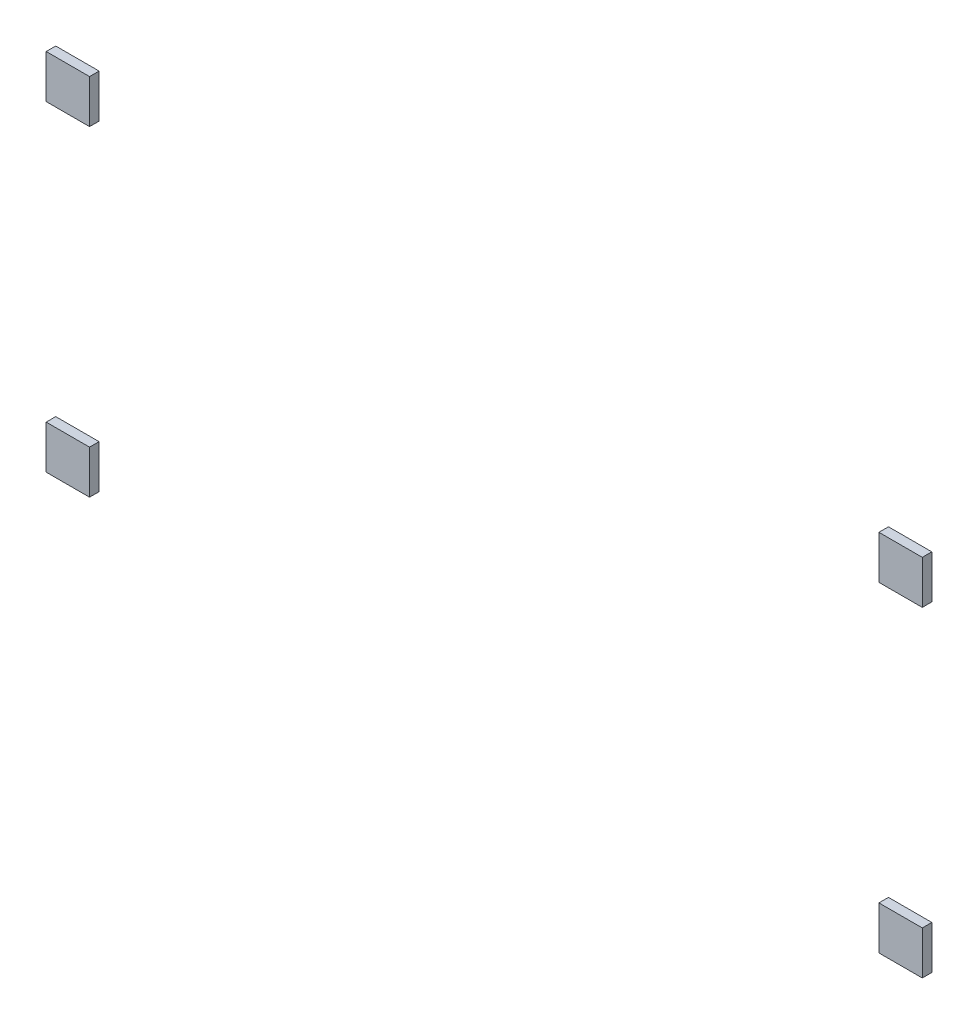
ISO-10303-21;
HEADER;
FILE_DESCRIPTION(('STEP AP214'),'2;1');
FILE_NAME('part.step','',(''),(''),'','','');
FILE_SCHEMA(('AUTOMOTIVE_DESIGN { 1 0 10303 214 1 1 1 1 }'));
ENDSEC;
DATA;
#1=APPLICATION_CONTEXT('core data for automotive mechanical design processes');
#2=APPLICATION_PROTOCOL_DEFINITION('international standard','automotive_design',2000,#1);
#3=PRODUCT_CONTEXT('',#1,'mechanical');
#4=PRODUCT('Part','Part','',(#3));
#5=PRODUCT_RELATED_PRODUCT_CATEGORY('part','',(#4));
#6=PRODUCT_DEFINITION_FORMATION('','',#4);
#7=PRODUCT_DEFINITION_CONTEXT('part definition',#1,'design');
#8=PRODUCT_DEFINITION('design','',#6,#7);
#9=PRODUCT_DEFINITION_SHAPE('','',#8);
#10=(LENGTH_UNIT() NAMED_UNIT(*) SI_UNIT(.MILLI.,.METRE.));
#11=(NAMED_UNIT(*) PLANE_ANGLE_UNIT() SI_UNIT($,.RADIAN.));
#12=(NAMED_UNIT(*) SI_UNIT($,.STERADIAN.) SOLID_ANGLE_UNIT());
#13=UNCERTAINTY_MEASURE_WITH_UNIT(LENGTH_MEASURE(1.E-05),#10,'distance_accuracy_value','');
#14=(GEOMETRIC_REPRESENTATION_CONTEXT(3) GLOBAL_UNCERTAINTY_ASSIGNED_CONTEXT((#13)) GLOBAL_UNIT_ASSIGNED_CONTEXT((#10,
#11,#12)) REPRESENTATION_CONTEXT('',''));
#15=CARTESIAN_POINT('',(0.,0.,0.));
#16=DIRECTION('',(0.,0.,1.));
#17=DIRECTION('',(1.,0.,0.));
#18=AXIS2_PLACEMENT_3D('',#15,#16,#17);
#19=CARTESIAN_POINT('',(-505.,160.,6.));
#20=DIRECTION('',(0.,0.,1.));
#21=DIRECTION('',(1.,0.,0.));
#22=AXIS2_PLACEMENT_3D('',#19,#20,#21);
#23=PLANE('',#22);
#24=DIRECTION('',(0.,1.,0.));
#25=VECTOR('',#24,1.);
#26=CARTESIAN_POINT('',(-505.,160.,6.));
#27=LINE('',#26,#25);
#28=CARTESIAN_POINT('',(-505.,160.,6.));
#29=VERTEX_POINT('',#28);
#30=CARTESIAN_POINT('',(-505.,210.,6.));
#31=VERTEX_POINT('',#30);
#32=EDGE_CURVE('P0_E56',#29,#31,#27,.T.);
#33=ORIENTED_EDGE('',*,*,#32,.F.);
#34=DIRECTION('',(1.,0.,0.));
#35=VECTOR('',#34,1.);
#36=CARTESIAN_POINT('',(-505.,160.,6.));
#37=LINE('',#36,#35);
#38=CARTESIAN_POINT('',(-455.,160.,6.));
#39=VERTEX_POINT('',#38);
#40=EDGE_CURVE('P0_E52',#29,#39,#37,.T.);
#41=ORIENTED_EDGE('',*,*,#40,.T.);
#42=DIRECTION('',(0.,1.,0.));
#43=VECTOR('',#42,1.);
#44=CARTESIAN_POINT('',(-455.,160.,6.));
#45=LINE('',#44,#43);
#46=CARTESIAN_POINT('',(-455.,210.,6.));
#47=VERTEX_POINT('',#46);
#48=EDGE_CURVE('P0_E54',#39,#47,#45,.T.);
#49=ORIENTED_EDGE('',*,*,#48,.T.);
#50=DIRECTION('',(1.,0.,0.));
#51=VECTOR('',#50,1.);
#52=CARTESIAN_POINT('',(-505.,210.,6.));
#53=LINE('',#52,#51);
#54=EDGE_CURVE('P0_E11',#31,#47,#53,.T.);
#55=ORIENTED_EDGE('',*,*,#54,.F.);
#56=EDGE_LOOP('',(#33,#41,#49,#55));
#57=FACE_BOUND('',#56,.T.);
#58=ADVANCED_FACE('P0_F17',(#57),#23,.T.);
#59=CARTESIAN_POINT('',(-505.,160.,-5.));
#60=DIRECTION('',(0.,0.,1.));
#61=DIRECTION('',(1.,0.,0.));
#62=AXIS2_PLACEMENT_3D('',#59,#60,#61);
#63=PLANE('',#62);
#64=DIRECTION('',(1.,0.,0.));
#65=VECTOR('',#64,1.);
#66=CARTESIAN_POINT('',(-505.,210.,-5.));
#67=LINE('',#66,#65);
#68=CARTESIAN_POINT('',(-505.,210.,-5.));
#69=VERTEX_POINT('',#68);
#70=CARTESIAN_POINT('',(-455.,210.,-5.));
#71=VERTEX_POINT('',#70);
#72=EDGE_CURVE('P0_E27',#69,#71,#67,.T.);
#73=ORIENTED_EDGE('',*,*,#72,.T.);
#74=DIRECTION('',(0.,1.,0.));
#75=VECTOR('',#74,1.);
#76=CARTESIAN_POINT('',(-455.,160.,-5.));
#77=LINE('',#76,#75);
#78=CARTESIAN_POINT('',(-455.,160.,-5.));
#79=VERTEX_POINT('',#78);
#80=EDGE_CURVE('P0_E77',#79,#71,#77,.T.);
#81=ORIENTED_EDGE('',*,*,#80,.F.);
#82=DIRECTION('',(1.,0.,0.));
#83=VECTOR('',#82,1.);
#84=CARTESIAN_POINT('',(-505.,160.,-5.));
#85=LINE('',#84,#83);
#86=CARTESIAN_POINT('',(-505.,160.,-5.));
#87=VERTEX_POINT('',#86);
#88=EDGE_CURVE('P0_E65',#87,#79,#85,.T.);
#89=ORIENTED_EDGE('',*,*,#88,.F.);
#90=DIRECTION('',(0.,1.,0.));
#91=VECTOR('',#90,1.);
#92=CARTESIAN_POINT('',(-505.,160.,-5.));
#93=LINE('',#92,#91);
#94=EDGE_CURVE('P0_E88',#87,#69,#93,.T.);
#95=ORIENTED_EDGE('',*,*,#94,.T.);
#96=EDGE_LOOP('',(#73,#81,#89,#95));
#97=FACE_BOUND('',#96,.T.);
#98=ADVANCED_FACE('P0_F129',(#97),#63,.F.);
#99=CARTESIAN_POINT('',(-505.,210.,-5.));
#100=DIRECTION('',(0.,1.,0.));
#101=DIRECTION('',(1.,0.,0.));
#102=AXIS2_PLACEMENT_3D('',#99,#100,#101);
#103=PLANE('',#102);
#104=ORIENTED_EDGE('',*,*,#72,.F.);
#105=DIRECTION('',(0.,0.,1.));
#106=VECTOR('',#105,1.);
#107=CARTESIAN_POINT('',(-505.,210.,-5.));
#108=LINE('',#107,#106);
#109=EDGE_CURVE('P0_E162',#69,#31,#108,.T.);
#110=ORIENTED_EDGE('',*,*,#109,.T.);
#111=ORIENTED_EDGE('',*,*,#54,.T.);
#112=DIRECTION('',(0.,0.,1.));
#113=VECTOR('',#112,1.);
#114=CARTESIAN_POINT('',(-455.,210.,-5.));
#115=LINE('',#114,#113);
#116=EDGE_CURVE('P0_E71',#71,#47,#115,.T.);
#117=ORIENTED_EDGE('',*,*,#116,.F.);
#118=EDGE_LOOP('',(#104,#110,#111,#117));
#119=FACE_BOUND('',#118,.T.);
#120=ADVANCED_FACE('P0_F125',(#119),#103,.T.);
#121=CARTESIAN_POINT('',(-505.,160.,-5.));
#122=DIRECTION('',(0.,1.,0.));
#123=DIRECTION('',(1.,0.,0.));
#124=AXIS2_PLACEMENT_3D('',#121,#122,#123);
#125=PLANE('',#124);
#126=DIRECTION('',(0.,0.,1.));
#127=VECTOR('',#126,1.);
#128=CARTESIAN_POINT('',(-455.,160.,-5.));
#129=LINE('',#128,#127);
#130=EDGE_CURVE('P0_E75',#79,#39,#129,.T.);
#131=ORIENTED_EDGE('',*,*,#130,.T.);
#132=ORIENTED_EDGE('',*,*,#40,.F.);
#133=DIRECTION('',(0.,0.,1.));
#134=VECTOR('',#133,1.);
#135=CARTESIAN_POINT('',(-505.,160.,-5.));
#136=LINE('',#135,#134);
#137=EDGE_CURVE('P0_E78',#87,#29,#136,.T.);
#138=ORIENTED_EDGE('',*,*,#137,.F.);
#139=ORIENTED_EDGE('',*,*,#88,.T.);
#140=EDGE_LOOP('',(#131,#132,#138,#139));
#141=FACE_BOUND('',#140,.T.);
#142=ADVANCED_FACE('P0_F72',(#141),#125,.F.);
#143=CARTESIAN_POINT('',(-455.,160.,-5.));
#144=DIRECTION('',(1.,0.,0.));
#145=DIRECTION('',(0.,1.,0.));
#146=AXIS2_PLACEMENT_3D('',#143,#144,#145);
#147=PLANE('',#146);
#148=ORIENTED_EDGE('',*,*,#130,.F.);
#149=ORIENTED_EDGE('',*,*,#80,.T.);
#150=ORIENTED_EDGE('',*,*,#116,.T.);
#151=ORIENTED_EDGE('',*,*,#48,.F.);
#152=EDGE_LOOP('',(#148,#149,#150,#151));
#153=FACE_BOUND('',#152,.T.);
#154=ADVANCED_FACE('P0_F67',(#153),#147,.T.);
#155=CARTESIAN_POINT('',(-505.,160.,-5.));
#156=DIRECTION('',(1.,0.,0.));
#157=DIRECTION('',(0.,1.,0.));
#158=AXIS2_PLACEMENT_3D('',#155,#156,#157);
#159=PLANE('',#158);
#160=ORIENTED_EDGE('',*,*,#32,.T.);
#161=ORIENTED_EDGE('',*,*,#109,.F.);
#162=ORIENTED_EDGE('',*,*,#94,.F.);
#163=ORIENTED_EDGE('',*,*,#137,.T.);
#164=EDGE_LOOP('',(#160,#161,#162,#163));
#165=FACE_BOUND('',#164,.T.);
#166=ADVANCED_FACE('P0_F101',(#165),#159,.F.);
#167=CLOSED_SHELL('',(#58,#98,#120,#142,#154,#166));
#168=MANIFOLD_SOLID_BREP('P0_B1',#167);
#169=CARTESIAN_POINT('',(455.,-210.,6.));
#170=DIRECTION('',(0.,0.,1.));
#171=DIRECTION('',(1.,0.,0.));
#172=AXIS2_PLACEMENT_3D('',#169,#170,#171);
#173=PLANE('',#172);
#174=DIRECTION('',(0.,1.,0.));
#175=VECTOR('',#174,1.);
#176=CARTESIAN_POINT('',(455.,-210.,6.));
#177=LINE('',#176,#175);
#178=CARTESIAN_POINT('',(455.,-210.,6.));
#179=VERTEX_POINT('',#178);
#180=CARTESIAN_POINT('',(455.,-160.,6.));
#181=VERTEX_POINT('',#180);
#182=EDGE_CURVE('P1_E86',#179,#181,#177,.T.);
#183=ORIENTED_EDGE('',*,*,#182,.F.);
#184=DIRECTION('',(1.,0.,0.));
#185=VECTOR('',#184,1.);
#186=CARTESIAN_POINT('',(455.,-210.,6.));
#187=LINE('',#186,#185);
#188=CARTESIAN_POINT('',(505.,-210.,6.));
#189=VERTEX_POINT('',#188);
#190=EDGE_CURVE('P1_E69',#179,#189,#187,.T.);
#191=ORIENTED_EDGE('',*,*,#190,.T.);
#192=DIRECTION('',(0.,1.,0.));
#193=VECTOR('',#192,1.);
#194=CARTESIAN_POINT('',(505.,-210.,6.));
#195=LINE('',#194,#193);
#196=CARTESIAN_POINT('',(505.,-160.,6.));
#197=VERTEX_POINT('',#196);
#198=EDGE_CURVE('P1_E85',#189,#197,#195,.T.);
#199=ORIENTED_EDGE('',*,*,#198,.T.);
#200=DIRECTION('',(1.,0.,0.));
#201=VECTOR('',#200,1.);
#202=CARTESIAN_POINT('',(455.,-160.,6.));
#203=LINE('',#202,#201);
#204=EDGE_CURVE('P1_E11',#181,#197,#203,.T.);
#205=ORIENTED_EDGE('',*,*,#204,.F.);
#206=EDGE_LOOP('',(#183,#191,#199,#205));
#207=FACE_BOUND('',#206,.T.);
#208=ADVANCED_FACE('P1_F17',(#207),#173,.T.);
#209=CARTESIAN_POINT('',(455.,-210.,-5.));
#210=DIRECTION('',(0.,0.,1.));
#211=DIRECTION('',(1.,0.,0.));
#212=AXIS2_PLACEMENT_3D('',#209,#210,#211);
#213=PLANE('',#212);
#214=DIRECTION('',(1.,0.,0.));
#215=VECTOR('',#214,1.);
#216=CARTESIAN_POINT('',(455.,-160.,-5.));
#217=LINE('',#216,#215);
#218=CARTESIAN_POINT('',(455.,-160.,-5.));
#219=VERTEX_POINT('',#218);
#220=CARTESIAN_POINT('',(505.,-160.,-5.));
#221=VERTEX_POINT('',#220);
#222=EDGE_CURVE('P1_E25',#219,#221,#217,.T.);
#223=ORIENTED_EDGE('',*,*,#222,.T.);
#224=DIRECTION('',(0.,1.,0.));
#225=VECTOR('',#224,1.);
#226=CARTESIAN_POINT('',(505.,-210.,-5.));
#227=LINE('',#226,#225);
#228=CARTESIAN_POINT('',(505.,-210.,-5.));
#229=VERTEX_POINT('',#228);
#230=EDGE_CURVE('P1_E108',#229,#221,#227,.T.);
#231=ORIENTED_EDGE('',*,*,#230,.F.);
#232=DIRECTION('',(1.,0.,0.));
#233=VECTOR('',#232,1.);
#234=CARTESIAN_POINT('',(455.,-210.,-5.));
#235=LINE('',#234,#233);
#236=CARTESIAN_POINT('',(455.,-210.,-5.));
#237=VERTEX_POINT('',#236);
#238=EDGE_CURVE('P1_E81',#237,#229,#235,.T.);
#239=ORIENTED_EDGE('',*,*,#238,.F.);
#240=DIRECTION('',(0.,1.,0.));
#241=VECTOR('',#240,1.);
#242=CARTESIAN_POINT('',(455.,-210.,-5.));
#243=LINE('',#242,#241);
#244=EDGE_CURVE('P1_E90',#237,#219,#243,.T.);
#245=ORIENTED_EDGE('',*,*,#244,.T.);
#246=EDGE_LOOP('',(#223,#231,#239,#245));
#247=FACE_BOUND('',#246,.T.);
#248=ADVANCED_FACE('P1_F148',(#247),#213,.F.);
#249=CARTESIAN_POINT('',(455.,-160.,-5.));
#250=DIRECTION('',(0.,1.,0.));
#251=DIRECTION('',(1.,0.,0.));
#252=AXIS2_PLACEMENT_3D('',#249,#250,#251);
#253=PLANE('',#252);
#254=ORIENTED_EDGE('',*,*,#222,.F.);
#255=DIRECTION('',(0.,0.,1.));
#256=VECTOR('',#255,1.);
#257=CARTESIAN_POINT('',(455.,-160.,-5.));
#258=LINE('',#257,#256);
#259=EDGE_CURVE('P1_E91',#219,#181,#258,.T.);
#260=ORIENTED_EDGE('',*,*,#259,.T.);
#261=ORIENTED_EDGE('',*,*,#204,.T.);
#262=DIRECTION('',(0.,0.,1.));
#263=VECTOR('',#262,1.);
#264=CARTESIAN_POINT('',(505.,-160.,-5.));
#265=LINE('',#264,#263);
#266=EDGE_CURVE('P1_E104',#221,#197,#265,.T.);
#267=ORIENTED_EDGE('',*,*,#266,.F.);
#268=EDGE_LOOP('',(#254,#260,#261,#267));
#269=FACE_BOUND('',#268,.T.);
#270=ADVANCED_FACE('P1_F138',(#269),#253,.T.);
#271=CARTESIAN_POINT('',(455.,-210.,-5.));
#272=DIRECTION('',(0.,1.,0.));
#273=DIRECTION('',(1.,0.,0.));
#274=AXIS2_PLACEMENT_3D('',#271,#272,#273);
#275=PLANE('',#274);
#276=DIRECTION('',(0.,0.,1.));
#277=VECTOR('',#276,1.);
#278=CARTESIAN_POINT('',(505.,-210.,-5.));
#279=LINE('',#278,#277);
#280=EDGE_CURVE('P1_E76',#229,#189,#279,.T.);
#281=ORIENTED_EDGE('',*,*,#280,.T.);
#282=ORIENTED_EDGE('',*,*,#190,.F.);
#283=DIRECTION('',(0.,0.,1.));
#284=VECTOR('',#283,1.);
#285=CARTESIAN_POINT('',(455.,-210.,-5.));
#286=LINE('',#285,#284);
#287=EDGE_CURVE('P1_E73',#237,#179,#286,.T.);
#288=ORIENTED_EDGE('',*,*,#287,.F.);
#289=ORIENTED_EDGE('',*,*,#238,.T.);
#290=EDGE_LOOP('',(#281,#282,#288,#289));
#291=FACE_BOUND('',#290,.T.);
#292=ADVANCED_FACE('P1_F71',(#291),#275,.F.);
#293=CARTESIAN_POINT('',(505.,-210.,-5.));
#294=DIRECTION('',(1.,0.,0.));
#295=DIRECTION('',(0.,1.,0.));
#296=AXIS2_PLACEMENT_3D('',#293,#294,#295);
#297=PLANE('',#296);
#298=ORIENTED_EDGE('',*,*,#280,.F.);
#299=ORIENTED_EDGE('',*,*,#230,.T.);
#300=ORIENTED_EDGE('',*,*,#266,.T.);
#301=ORIENTED_EDGE('',*,*,#198,.F.);
#302=EDGE_LOOP('',(#298,#299,#300,#301));
#303=FACE_BOUND('',#302,.T.);
#304=ADVANCED_FACE('P1_F121',(#303),#297,.T.);
#305=CARTESIAN_POINT('',(455.,-210.,-5.));
#306=DIRECTION('',(1.,0.,0.));
#307=DIRECTION('',(0.,1.,0.));
#308=AXIS2_PLACEMENT_3D('',#305,#306,#307);
#309=PLANE('',#308);
#310=ORIENTED_EDGE('',*,*,#182,.T.);
#311=ORIENTED_EDGE('',*,*,#259,.F.);
#312=ORIENTED_EDGE('',*,*,#244,.F.);
#313=ORIENTED_EDGE('',*,*,#287,.T.);
#314=EDGE_LOOP('',(#310,#311,#312,#313));
#315=FACE_BOUND('',#314,.T.);
#316=ADVANCED_FACE('P1_F88',(#315),#309,.F.);
#317=CLOSED_SHELL('',(#208,#248,#270,#292,#304,#316));
#318=MANIFOLD_SOLID_BREP('P1_B1',#317);
#319=CARTESIAN_POINT('',(-505.,-210.,6.));
#320=DIRECTION('',(0.,0.,1.));
#321=DIRECTION('',(1.,0.,0.));
#322=AXIS2_PLACEMENT_3D('',#319,#320,#321);
#323=PLANE('',#322);
#324=DIRECTION('',(0.,1.,0.));
#325=VECTOR('',#324,1.);
#326=CARTESIAN_POINT('',(-505.,-210.,6.));
#327=LINE('',#326,#325);
#328=CARTESIAN_POINT('',(-505.,-210.,6.));
#329=VERTEX_POINT('',#328);
#330=CARTESIAN_POINT('',(-505.,-160.,6.));
#331=VERTEX_POINT('',#330);
#332=EDGE_CURVE('P2_E89',#329,#331,#327,.T.);
#333=ORIENTED_EDGE('',*,*,#332,.F.);
#334=DIRECTION('',(1.,0.,0.));
#335=VECTOR('',#334,1.);
#336=CARTESIAN_POINT('',(-505.,-210.,6.));
#337=LINE('',#336,#335);
#338=CARTESIAN_POINT('',(-455.,-210.,6.));
#339=VERTEX_POINT('',#338);
#340=EDGE_CURVE('P2_E71',#329,#339,#337,.T.);
#341=ORIENTED_EDGE('',*,*,#340,.T.);
#342=DIRECTION('',(0.,1.,0.));
#343=VECTOR('',#342,1.);
#344=CARTESIAN_POINT('',(-455.,-210.,6.));
#345=LINE('',#344,#343);
#346=CARTESIAN_POINT('',(-455.,-160.,6.));
#347=VERTEX_POINT('',#346);
#348=EDGE_CURVE('P2_E82',#339,#347,#345,.T.);
#349=ORIENTED_EDGE('',*,*,#348,.T.);
#350=DIRECTION('',(1.,0.,0.));
#351=VECTOR('',#350,1.);
#352=CARTESIAN_POINT('',(-505.,-160.,6.));
#353=LINE('',#352,#351);
#354=EDGE_CURVE('P2_E11',#331,#347,#353,.T.);
#355=ORIENTED_EDGE('',*,*,#354,.F.);
#356=EDGE_LOOP('',(#333,#341,#349,#355));
#357=FACE_BOUND('',#356,.T.);
#358=ADVANCED_FACE('P2_F17',(#357),#323,.T.);
#359=CARTESIAN_POINT('',(-505.,-210.,-5.));
#360=DIRECTION('',(0.,0.,1.));
#361=DIRECTION('',(1.,0.,0.));
#362=AXIS2_PLACEMENT_3D('',#359,#360,#361);
#363=PLANE('',#362);
#364=DIRECTION('',(1.,0.,0.));
#365=VECTOR('',#364,1.);
#366=CARTESIAN_POINT('',(-505.,-160.,-5.));
#367=LINE('',#366,#365);
#368=CARTESIAN_POINT('',(-505.,-160.,-5.));
#369=VERTEX_POINT('',#368);
#370=CARTESIAN_POINT('',(-455.,-160.,-5.));
#371=VERTEX_POINT('',#370);
#372=EDGE_CURVE('P2_E21',#369,#371,#367,.T.);
#373=ORIENTED_EDGE('',*,*,#372,.T.);
#374=DIRECTION('',(0.,1.,0.));
#375=VECTOR('',#374,1.);
#376=CARTESIAN_POINT('',(-455.,-210.,-5.));
#377=LINE('',#376,#375);
#378=CARTESIAN_POINT('',(-455.,-210.,-5.));
#379=VERTEX_POINT('',#378);
#380=EDGE_CURVE('P2_E104',#379,#371,#377,.T.);
#381=ORIENTED_EDGE('',*,*,#380,.F.);
#382=DIRECTION('',(1.,0.,0.));
#383=VECTOR('',#382,1.);
#384=CARTESIAN_POINT('',(-505.,-210.,-5.));
#385=LINE('',#384,#383);
#386=CARTESIAN_POINT('',(-505.,-210.,-5.));
#387=VERTEX_POINT('',#386);
#388=EDGE_CURVE('P2_E83',#387,#379,#385,.T.);
#389=ORIENTED_EDGE('',*,*,#388,.F.);
#390=DIRECTION('',(0.,1.,0.));
#391=VECTOR('',#390,1.);
#392=CARTESIAN_POINT('',(-505.,-210.,-5.));
#393=LINE('',#392,#391);
#394=EDGE_CURVE('P2_E93',#387,#369,#393,.T.);
#395=ORIENTED_EDGE('',*,*,#394,.T.);
#396=EDGE_LOOP('',(#373,#381,#389,#395));
#397=FACE_BOUND('',#396,.T.);
#398=ADVANCED_FACE('P2_F19',(#397),#363,.F.);
#399=CARTESIAN_POINT('',(-505.,-160.,-5.));
#400=DIRECTION('',(0.,1.,0.));
#401=DIRECTION('',(1.,0.,0.));
#402=AXIS2_PLACEMENT_3D('',#399,#400,#401);
#403=PLANE('',#402);
#404=ORIENTED_EDGE('',*,*,#372,.F.);
#405=DIRECTION('',(0.,0.,1.));
#406=VECTOR('',#405,1.);
#407=CARTESIAN_POINT('',(-505.,-160.,-5.));
#408=LINE('',#407,#406);
#409=EDGE_CURVE('P2_E92',#369,#331,#408,.T.);
#410=ORIENTED_EDGE('',*,*,#409,.T.);
#411=ORIENTED_EDGE('',*,*,#354,.T.);
#412=DIRECTION('',(0.,0.,1.));
#413=VECTOR('',#412,1.);
#414=CARTESIAN_POINT('',(-455.,-160.,-5.));
#415=LINE('',#414,#413);
#416=EDGE_CURVE('P2_E106',#371,#347,#415,.T.);
#417=ORIENTED_EDGE('',*,*,#416,.F.);
#418=EDGE_LOOP('',(#404,#410,#411,#417));
#419=FACE_BOUND('',#418,.T.);
#420=ADVANCED_FACE('P2_F142',(#419),#403,.T.);
#421=CARTESIAN_POINT('',(-505.,-210.,-5.));
#422=DIRECTION('',(0.,1.,0.));
#423=DIRECTION('',(1.,0.,0.));
#424=AXIS2_PLACEMENT_3D('',#421,#422,#423);
#425=PLANE('',#424);
#426=DIRECTION('',(0.,0.,1.));
#427=VECTOR('',#426,1.);
#428=CARTESIAN_POINT('',(-455.,-210.,-5.));
#429=LINE('',#428,#427);
#430=EDGE_CURVE('P2_E77',#379,#339,#429,.T.);
#431=ORIENTED_EDGE('',*,*,#430,.T.);
#432=ORIENTED_EDGE('',*,*,#340,.F.);
#433=DIRECTION('',(0.,0.,1.));
#434=VECTOR('',#433,1.);
#435=CARTESIAN_POINT('',(-505.,-210.,-5.));
#436=LINE('',#435,#434);
#437=EDGE_CURVE('P2_E74',#387,#329,#436,.T.);
#438=ORIENTED_EDGE('',*,*,#437,.F.);
#439=ORIENTED_EDGE('',*,*,#388,.T.);
#440=EDGE_LOOP('',(#431,#432,#438,#439));
#441=FACE_BOUND('',#440,.T.);
#442=ADVANCED_FACE('P2_F72',(#441),#425,.F.);
#443=CARTESIAN_POINT('',(-455.,-210.,-5.));
#444=DIRECTION('',(1.,0.,0.));
#445=DIRECTION('',(0.,1.,0.));
#446=AXIS2_PLACEMENT_3D('',#443,#444,#445);
#447=PLANE('',#446);
#448=ORIENTED_EDGE('',*,*,#430,.F.);
#449=ORIENTED_EDGE('',*,*,#380,.T.);
#450=ORIENTED_EDGE('',*,*,#416,.T.);
#451=ORIENTED_EDGE('',*,*,#348,.F.);
#452=EDGE_LOOP('',(#448,#449,#450,#451));
#453=FACE_BOUND('',#452,.T.);
#454=ADVANCED_FACE('P2_F124',(#453),#447,.T.);
#455=CARTESIAN_POINT('',(-505.,-210.,-5.));
#456=DIRECTION('',(1.,0.,0.));
#457=DIRECTION('',(0.,1.,0.));
#458=AXIS2_PLACEMENT_3D('',#455,#456,#457);
#459=PLANE('',#458);
#460=ORIENTED_EDGE('',*,*,#332,.T.);
#461=ORIENTED_EDGE('',*,*,#409,.F.);
#462=ORIENTED_EDGE('',*,*,#394,.F.);
#463=ORIENTED_EDGE('',*,*,#437,.T.);
#464=EDGE_LOOP('',(#460,#461,#462,#463));
#465=FACE_BOUND('',#464,.T.);
#466=ADVANCED_FACE('P2_F86',(#465),#459,.F.);
#467=CLOSED_SHELL('',(#358,#398,#420,#442,#454,#466));
#468=MANIFOLD_SOLID_BREP('P2_B1',#467);
#469=CARTESIAN_POINT('',(455.,160.,6.));
#470=DIRECTION('',(0.,0.,1.));
#471=DIRECTION('',(1.,0.,0.));
#472=AXIS2_PLACEMENT_3D('',#469,#470,#471);
#473=PLANE('',#472);
#474=DIRECTION('',(0.,1.,0.));
#475=VECTOR('',#474,1.);
#476=CARTESIAN_POINT('',(455.,160.,6.));
#477=LINE('',#476,#475);
#478=CARTESIAN_POINT('',(455.,160.,6.));
#479=VERTEX_POINT('',#478);
#480=CARTESIAN_POINT('',(455.,210.,6.));
#481=VERTEX_POINT('',#480);
#482=EDGE_CURVE('P3_E81',#479,#481,#477,.T.);
#483=ORIENTED_EDGE('',*,*,#482,.F.);
#484=DIRECTION('',(1.,0.,0.));
#485=VECTOR('',#484,1.);
#486=CARTESIAN_POINT('',(455.,160.,6.));
#487=LINE('',#486,#485);
#488=CARTESIAN_POINT('',(505.,160.,6.));
#489=VERTEX_POINT('',#488);
#490=EDGE_CURVE('P3_E63',#479,#489,#487,.T.);
#491=ORIENTED_EDGE('',*,*,#490,.T.);
#492=DIRECTION('',(0.,1.,0.));
#493=VECTOR('',#492,1.);
#494=CARTESIAN_POINT('',(505.,160.,6.));
#495=LINE('',#494,#493);
#496=CARTESIAN_POINT('',(505.,210.,6.));
#497=VERTEX_POINT('',#496);
#498=EDGE_CURVE('P3_E76',#489,#497,#495,.T.);
#499=ORIENTED_EDGE('',*,*,#498,.T.);
#500=DIRECTION('',(1.,0.,0.));
#501=VECTOR('',#500,1.);
#502=CARTESIAN_POINT('',(455.,210.,6.));
#503=LINE('',#502,#501);
#504=EDGE_CURVE('P3_E10',#481,#497,#503,.T.);
#505=ORIENTED_EDGE('',*,*,#504,.F.);
#506=EDGE_LOOP('',(#483,#491,#499,#505));
#507=FACE_BOUND('',#506,.T.);
#508=ADVANCED_FACE('P3_F16',(#507),#473,.T.);
#509=CARTESIAN_POINT('',(455.,160.,-5.));
#510=DIRECTION('',(0.,0.,1.));
#511=DIRECTION('',(1.,0.,0.));
#512=AXIS2_PLACEMENT_3D('',#509,#510,#511);
#513=PLANE('',#512);
#514=DIRECTION('',(1.,0.,0.));
#515=VECTOR('',#514,1.);
#516=CARTESIAN_POINT('',(455.,210.,-5.));
#517=LINE('',#516,#515);
#518=CARTESIAN_POINT('',(455.,210.,-5.));
#519=VERTEX_POINT('',#518);
#520=CARTESIAN_POINT('',(505.,210.,-5.));
#521=VERTEX_POINT('',#520);
#522=EDGE_CURVE('P3_E25',#519,#521,#517,.T.);
#523=ORIENTED_EDGE('',*,*,#522,.T.);
#524=DIRECTION('',(0.,1.,0.));
#525=VECTOR('',#524,1.);
#526=CARTESIAN_POINT('',(505.,160.,-5.));
#527=LINE('',#526,#525);
#528=CARTESIAN_POINT('',(505.,160.,-5.));
#529=VERTEX_POINT('',#528);
#530=EDGE_CURVE('P3_E101',#529,#521,#527,.T.);
#531=ORIENTED_EDGE('',*,*,#530,.F.);
#532=DIRECTION('',(1.,0.,0.));
#533=VECTOR('',#532,1.);
#534=CARTESIAN_POINT('',(455.,160.,-5.));
#535=LINE('',#534,#533);
#536=CARTESIAN_POINT('',(455.,160.,-5.));
#537=VERTEX_POINT('',#536);
#538=EDGE_CURVE('P3_E74',#537,#529,#535,.T.);
#539=ORIENTED_EDGE('',*,*,#538,.F.);
#540=DIRECTION('',(0.,1.,0.));
#541=VECTOR('',#540,1.);
#542=CARTESIAN_POINT('',(455.,160.,-5.));
#543=LINE('',#542,#541);
#544=EDGE_CURVE('P3_E83',#537,#519,#543,.T.);
#545=ORIENTED_EDGE('',*,*,#544,.T.);
#546=EDGE_LOOP('',(#523,#531,#539,#545));
#547=FACE_BOUND('',#546,.T.);
#548=ADVANCED_FACE('P3_F116',(#547),#513,.F.);
#549=CARTESIAN_POINT('',(455.,210.,-5.));
#550=DIRECTION('',(0.,1.,0.));
#551=DIRECTION('',(1.,0.,0.));
#552=AXIS2_PLACEMENT_3D('',#549,#550,#551);
#553=PLANE('',#552);
#554=ORIENTED_EDGE('',*,*,#522,.F.);
#555=DIRECTION('',(0.,0.,1.));
#556=VECTOR('',#555,1.);
#557=CARTESIAN_POINT('',(455.,210.,-5.));
#558=LINE('',#557,#556);
#559=EDGE_CURVE('P3_E87',#519,#481,#558,.T.);
#560=ORIENTED_EDGE('',*,*,#559,.T.);
#561=ORIENTED_EDGE('',*,*,#504,.T.);
#562=DIRECTION('',(0.,0.,1.));
#563=VECTOR('',#562,1.);
#564=CARTESIAN_POINT('',(505.,210.,-5.));
#565=LINE('',#564,#563);
#566=EDGE_CURVE('P3_E104',#521,#497,#565,.T.);
#567=ORIENTED_EDGE('',*,*,#566,.F.);
#568=EDGE_LOOP('',(#554,#560,#561,#567));
#569=FACE_BOUND('',#568,.T.);
#570=ADVANCED_FACE('P3_F111',(#569),#553,.T.);
#571=CARTESIAN_POINT('',(455.,160.,-5.));
#572=DIRECTION('',(0.,1.,0.));
#573=DIRECTION('',(1.,0.,0.));
#574=AXIS2_PLACEMENT_3D('',#571,#572,#573);
#575=PLANE('',#574);
#576=DIRECTION('',(0.,0.,1.));
#577=VECTOR('',#576,1.);
#578=CARTESIAN_POINT('',(505.,160.,-5.));
#579=LINE('',#578,#577);
#580=EDGE_CURVE('P3_E69',#529,#489,#579,.T.);
#581=ORIENTED_EDGE('',*,*,#580,.T.);
#582=ORIENTED_EDGE('',*,*,#490,.F.);
#583=DIRECTION('',(0.,0.,1.));
#584=VECTOR('',#583,1.);
#585=CARTESIAN_POINT('',(455.,160.,-5.));
#586=LINE('',#585,#584);
#587=EDGE_CURVE('P3_E70',#537,#479,#586,.T.);
#588=ORIENTED_EDGE('',*,*,#587,.F.);
#589=ORIENTED_EDGE('',*,*,#538,.T.);
#590=EDGE_LOOP('',(#581,#582,#588,#589));
#591=FACE_BOUND('',#590,.T.);
#592=ADVANCED_FACE('P3_F66',(#591),#575,.F.);
#593=CARTESIAN_POINT('',(505.,160.,-5.));
#594=DIRECTION('',(1.,0.,0.));
#595=DIRECTION('',(0.,1.,0.));
#596=AXIS2_PLACEMENT_3D('',#593,#594,#595);
#597=PLANE('',#596);
#598=ORIENTED_EDGE('',*,*,#580,.F.);
#599=ORIENTED_EDGE('',*,*,#530,.T.);
#600=ORIENTED_EDGE('',*,*,#566,.T.);
#601=ORIENTED_EDGE('',*,*,#498,.F.);
#602=EDGE_LOOP('',(#598,#599,#600,#601));
#603=FACE_BOUND('',#602,.T.);
#604=ADVANCED_FACE('P3_F115',(#603),#597,.T.);
#605=CARTESIAN_POINT('',(455.,160.,-5.));
#606=DIRECTION('',(1.,0.,0.));
#607=DIRECTION('',(0.,1.,0.));
#608=AXIS2_PLACEMENT_3D('',#605,#606,#607);
#609=PLANE('',#608);
#610=ORIENTED_EDGE('',*,*,#482,.T.);
#611=ORIENTED_EDGE('',*,*,#559,.F.);
#612=ORIENTED_EDGE('',*,*,#544,.F.);
#613=ORIENTED_EDGE('',*,*,#587,.T.);
#614=EDGE_LOOP('',(#610,#611,#612,#613));
#615=FACE_BOUND('',#614,.T.);
#616=ADVANCED_FACE('P3_F78',(#615),#609,.F.);
#617=CLOSED_SHELL('',(#508,#548,#570,#592,#604,#616));
#618=MANIFOLD_SOLID_BREP('P3_B1',#617);
#619=ADVANCED_BREP_SHAPE_REPRESENTATION('',(#18,#168,#318,#468,#618),#14);
#620=SHAPE_DEFINITION_REPRESENTATION(#9,#619);
ENDSEC;
END-ISO-10303-21;
